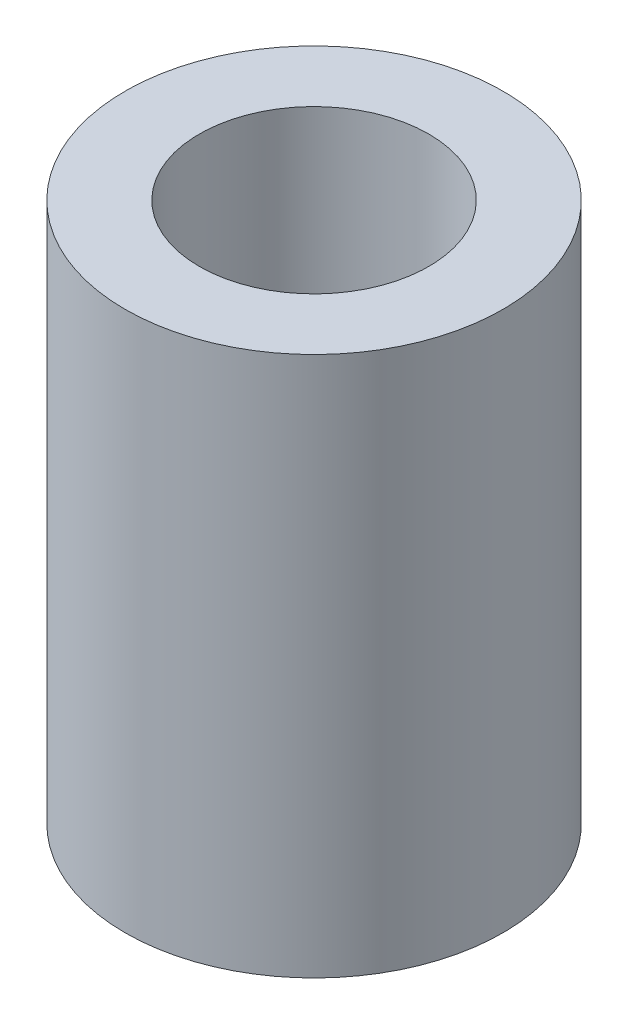
ISO-10303-21;
HEADER;
FILE_DESCRIPTION(('STEP AP214'),'2;1');
FILE_NAME('part.step','',(''),(''),'','','');
FILE_SCHEMA(('AUTOMOTIVE_DESIGN { 1 0 10303 214 1 1 1 1 }'));
ENDSEC;
DATA;
#1=APPLICATION_CONTEXT('core data for automotive mechanical design processes');
#2=APPLICATION_PROTOCOL_DEFINITION('international standard','automotive_design',2000,#1);
#3=PRODUCT_CONTEXT('',#1,'mechanical');
#4=PRODUCT('Part','Part','',(#3));
#5=PRODUCT_RELATED_PRODUCT_CATEGORY('part','',(#4));
#6=PRODUCT_DEFINITION_FORMATION('','',#4);
#7=PRODUCT_DEFINITION_CONTEXT('part definition',#1,'design');
#8=PRODUCT_DEFINITION('design','',#6,#7);
#9=PRODUCT_DEFINITION_SHAPE('','',#8);
#10=(LENGTH_UNIT() NAMED_UNIT(*) SI_UNIT(.MILLI.,.METRE.));
#11=(NAMED_UNIT(*) PLANE_ANGLE_UNIT() SI_UNIT($,.RADIAN.));
#12=(NAMED_UNIT(*) SI_UNIT($,.STERADIAN.) SOLID_ANGLE_UNIT());
#13=UNCERTAINTY_MEASURE_WITH_UNIT(LENGTH_MEASURE(1.E-05),#10,'distance_accuracy_value','');
#14=(GEOMETRIC_REPRESENTATION_CONTEXT(3) GLOBAL_UNCERTAINTY_ASSIGNED_CONTEXT((#13)) GLOBAL_UNIT_ASSIGNED_CONTEXT((#10,
#11,#12)) REPRESENTATION_CONTEXT('',''));
#15=CARTESIAN_POINT('',(0.,0.,0.));
#16=DIRECTION('',(0.,0.,1.));
#17=DIRECTION('',(1.,0.,0.));
#18=AXIS2_PLACEMENT_3D('',#15,#16,#17);
#19=CARTESIAN_POINT('',(0.,10.,0.));
#20=DIRECTION('',(0.,1.,0.));
#21=DIRECTION('',(0.,0.,1.));
#22=AXIS2_PLACEMENT_3D('',#19,#20,#21);
#23=PLANE('',#22);
#24=CARTESIAN_POINT('',(0.,10.,0.));
#25=DIRECTION('',(0.,1.,0.));
#26=DIRECTION('',(0.,0.,1.));
#27=AXIS2_PLACEMENT_3D('',#24,#25,#26);
#28=CIRCLE('',#27,7.);
#29=CARTESIAN_POINT('',(0.,10.,7.));
#30=VERTEX_POINT('',#29);
#31=EDGE_CURVE('E12',#30,#30,#28,.T.);
#32=ORIENTED_EDGE('',*,*,#31,.T.);
#33=EDGE_LOOP('',(#32));
#34=FACE_BOUND('',#33,.T.);
#35=CARTESIAN_POINT('',(0.,10.,0.));
#36=DIRECTION('',(0.,1.,0.));
#37=DIRECTION('',(0.,0.,1.));
#38=AXIS2_PLACEMENT_3D('',#35,#36,#37);
#39=CIRCLE('',#38,4.25);
#40=CARTESIAN_POINT('',(0.,10.,4.25));
#41=VERTEX_POINT('',#40);
#42=EDGE_CURVE('E70',#41,#41,#39,.T.);
#43=ORIENTED_EDGE('',*,*,#42,.F.);
#44=EDGE_LOOP('',(#43));
#45=FACE_BOUND('',#44,.T.);
#46=ADVANCED_FACE('F52',(#34,#45),#23,.T.);
#47=CARTESIAN_POINT('',(0.,-10.,0.));
#48=DIRECTION('',(0.,1.,0.));
#49=DIRECTION('',(0.,0.,1.));
#50=AXIS2_PLACEMENT_3D('',#47,#48,#49);
#51=PLANE('',#50);
#52=CARTESIAN_POINT('',(0.,-10.,0.));
#53=DIRECTION('',(0.,1.,0.));
#54=DIRECTION('',(0.,0.,1.));
#55=AXIS2_PLACEMENT_3D('',#52,#53,#54);
#56=CIRCLE('',#55,7.);
#57=CARTESIAN_POINT('',(0.,-10.,7.));
#58=VERTEX_POINT('',#57);
#59=EDGE_CURVE('E60',#58,#58,#56,.T.);
#60=ORIENTED_EDGE('',*,*,#59,.F.);
#61=EDGE_LOOP('',(#60));
#62=FACE_BOUND('',#61,.T.);
#63=CARTESIAN_POINT('',(0.,-10.,0.));
#64=DIRECTION('',(0.,1.,0.));
#65=DIRECTION('',(0.,0.,1.));
#66=AXIS2_PLACEMENT_3D('',#63,#64,#65);
#67=CIRCLE('',#66,4.25);
#68=CARTESIAN_POINT('',(0.,-10.,4.25));
#69=VERTEX_POINT('',#68);
#70=EDGE_CURVE('E69',#69,#69,#67,.T.);
#71=ORIENTED_EDGE('',*,*,#70,.T.);
#72=EDGE_LOOP('',(#71));
#73=FACE_BOUND('',#72,.T.);
#74=ADVANCED_FACE('F85',(#62,#73),#51,.F.);
#75=CARTESIAN_POINT('',(0.,10.,0.));
#76=DIRECTION('',(0.,-1.,0.));
#77=DIRECTION('',(0.,0.,-1.));
#78=AXIS2_PLACEMENT_3D('',#75,#76,#77);
#79=CYLINDRICAL_SURFACE('',#78,7.);
#80=ORIENTED_EDGE('',*,*,#31,.F.);
#81=EDGE_LOOP('',(#80));
#82=FACE_BOUND('',#81,.T.);
#83=ORIENTED_EDGE('',*,*,#59,.T.);
#84=EDGE_LOOP('',(#83));
#85=FACE_BOUND('',#84,.T.);
#86=ADVANCED_FACE('F54',(#82,#85),#79,.T.);
#87=CARTESIAN_POINT('',(0.,10.,0.));
#88=DIRECTION('',(0.,-1.,0.));
#89=DIRECTION('',(0.,0.,-1.));
#90=AXIS2_PLACEMENT_3D('',#87,#88,#89);
#91=CYLINDRICAL_SURFACE('',#90,4.25);
#92=ORIENTED_EDGE('',*,*,#42,.T.);
#93=EDGE_LOOP('',(#92));
#94=FACE_BOUND('',#93,.T.);
#95=ORIENTED_EDGE('',*,*,#70,.F.);
#96=EDGE_LOOP('',(#95));
#97=FACE_BOUND('',#96,.T.);
#98=ADVANCED_FACE('F78',(#94,#97),#91,.F.);
#99=CLOSED_SHELL('',(#46,#74,#86,#98));
#100=MANIFOLD_SOLID_BREP('B2',#99);
#101=ADVANCED_BREP_SHAPE_REPRESENTATION('',(#18,#100),#14);
#102=SHAPE_DEFINITION_REPRESENTATION(#9,#101);
ENDSEC;
END-ISO-10303-21;
